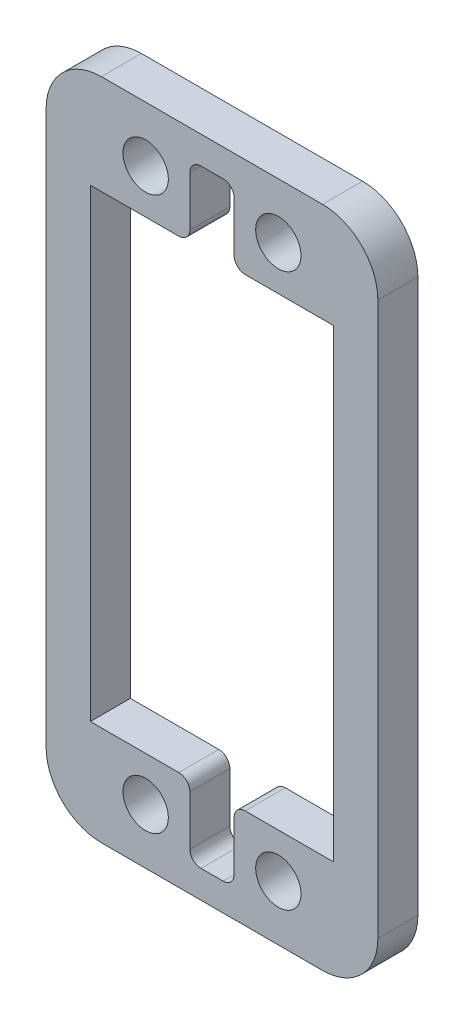
ISO-10303-21;
HEADER;
FILE_DESCRIPTION(('STEP AP214'),'2;1');
FILE_NAME('part.step','',(''),(''),'','','');
FILE_SCHEMA(('AUTOMOTIVE_DESIGN { 1 0 10303 214 1 1 1 1 }'));
ENDSEC;
DATA;
#1=APPLICATION_CONTEXT('core data for automotive mechanical design processes');
#2=APPLICATION_PROTOCOL_DEFINITION('international standard','automotive_design',2000,#1);
#3=PRODUCT_CONTEXT('',#1,'mechanical');
#4=PRODUCT('Part','Part','',(#3));
#5=PRODUCT_RELATED_PRODUCT_CATEGORY('part','',(#4));
#6=PRODUCT_DEFINITION_FORMATION('','',#4);
#7=PRODUCT_DEFINITION_CONTEXT('part definition',#1,'design');
#8=PRODUCT_DEFINITION('design','',#6,#7);
#9=PRODUCT_DEFINITION_SHAPE('','',#8);
#10=(LENGTH_UNIT() NAMED_UNIT(*) SI_UNIT(.MILLI.,.METRE.));
#11=(NAMED_UNIT(*) PLANE_ANGLE_UNIT() SI_UNIT($,.RADIAN.));
#12=(NAMED_UNIT(*) SI_UNIT($,.STERADIAN.) SOLID_ANGLE_UNIT());
#13=UNCERTAINTY_MEASURE_WITH_UNIT(LENGTH_MEASURE(1.E-05),#10,'distance_accuracy_value','');
#14=(GEOMETRIC_REPRESENTATION_CONTEXT(3) GLOBAL_UNCERTAINTY_ASSIGNED_CONTEXT((#13)) GLOBAL_UNIT_ASSIGNED_CONTEXT((#10,
#11,#12)) REPRESENTATION_CONTEXT('',''));
#15=CARTESIAN_POINT('',(0.,0.,0.));
#16=DIRECTION('',(0.,0.,1.));
#17=DIRECTION('',(1.,0.,0.));
#18=AXIS2_PLACEMENT_3D('',#15,#16,#17);
#19=CARTESIAN_POINT('',(11.,21.,3.62));
#20=DIRECTION('',(0.,1.,0.));
#21=DIRECTION('',(0.,0.,1.));
#22=AXIS2_PLACEMENT_3D('',#19,#20,#21);
#23=PLANE('',#22);
#24=DIRECTION('',(1.,0.,0.));
#25=VECTOR('',#24,1.);
#26=CARTESIAN_POINT('',(11.,21.,0.));
#27=LINE('',#26,#25);
#28=CARTESIAN_POINT('',(-11.,21.,0.));
#29=VERTEX_POINT('',#28);
#30=CARTESIAN_POINT('',(-3.,21.,0.));
#31=VERTEX_POINT('',#30);
#32=EDGE_CURVE('E252',#29,#31,#27,.T.);
#33=ORIENTED_EDGE('',*,*,#32,.T.);
#34=DIRECTION('',(0.,0.,1.));
#35=VECTOR('',#34,1.);
#36=CARTESIAN_POINT('',(-3.,21.,3.62));
#37=LINE('',#36,#35);
#38=CARTESIAN_POINT('',(-3.,21.,3.62));
#39=VERTEX_POINT('',#38);
#40=EDGE_CURVE('E388',#31,#39,#37,.T.);
#41=ORIENTED_EDGE('',*,*,#40,.T.);
#42=DIRECTION('',(1.,0.,0.));
#43=VECTOR('',#42,1.);
#44=CARTESIAN_POINT('',(11.,21.,3.62));
#45=LINE('',#44,#43);
#46=CARTESIAN_POINT('',(-11.,21.,3.62));
#47=VERTEX_POINT('',#46);
#48=EDGE_CURVE('E236',#47,#39,#45,.T.);
#49=ORIENTED_EDGE('',*,*,#48,.F.);
#50=DIRECTION('',(0.,0.,-1.));
#51=VECTOR('',#50,1.);
#52=CARTESIAN_POINT('',(-11.,21.,3.62));
#53=LINE('',#52,#51);
#54=EDGE_CURVE('E276',#47,#29,#53,.T.);
#55=ORIENTED_EDGE('',*,*,#54,.T.);
#56=EDGE_LOOP('',(#33,#41,#49,#55));
#57=FACE_BOUND('',#56,.T.);
#58=ADVANCED_FACE('F39',(#57),#23,.F.);
#59=CARTESIAN_POINT('',(-11.,-21.,3.62));
#60=DIRECTION('',(0.,-1.,0.));
#61=DIRECTION('',(0.,0.,-1.));
#62=AXIS2_PLACEMENT_3D('',#59,#60,#61);
#63=PLANE('',#62);
#64=DIRECTION('',(-1.,0.,0.));
#65=VECTOR('',#64,1.);
#66=CARTESIAN_POINT('',(-11.,-21.,3.62));
#67=LINE('',#66,#65);
#68=CARTESIAN_POINT('',(-3.00000000000001,-21.,3.62));
#69=VERTEX_POINT('',#68);
#70=CARTESIAN_POINT('',(-11.,-21.,3.62));
#71=VERTEX_POINT('',#70);
#72=EDGE_CURVE('E244',#69,#71,#67,.T.);
#73=ORIENTED_EDGE('',*,*,#72,.F.);
#74=DIRECTION('',(0.,0.,-1.));
#75=VECTOR('',#74,1.);
#76=CARTESIAN_POINT('',(-3.00000000000001,-21.,3.62));
#77=LINE('',#76,#75);
#78=CARTESIAN_POINT('',(-3.00000000000001,-21.,0.));
#79=VERTEX_POINT('',#78);
#80=EDGE_CURVE('E349',#69,#79,#77,.T.);
#81=ORIENTED_EDGE('',*,*,#80,.T.);
#82=DIRECTION('',(-1.,0.,0.));
#83=VECTOR('',#82,1.);
#84=CARTESIAN_POINT('',(-11.,-21.,0.));
#85=LINE('',#84,#83);
#86=CARTESIAN_POINT('',(-11.,-21.,0.));
#87=VERTEX_POINT('',#86);
#88=EDGE_CURVE('E266',#79,#87,#85,.T.);
#89=ORIENTED_EDGE('',*,*,#88,.T.);
#90=DIRECTION('',(0.,0.,-1.));
#91=VECTOR('',#90,1.);
#92=CARTESIAN_POINT('',(-11.,-21.,3.62));
#93=LINE('',#92,#91);
#94=EDGE_CURVE('E235',#71,#87,#93,.T.);
#95=ORIENTED_EDGE('',*,*,#94,.F.);
#96=EDGE_LOOP('',(#73,#81,#89,#95));
#97=FACE_BOUND('',#96,.T.);
#98=ADVANCED_FACE('F515',(#97),#63,.F.);
#99=CARTESIAN_POINT('',(-15.,-30.,3.62));
#100=DIRECTION('',(1.,0.,0.));
#101=DIRECTION('',(0.,0.,-1.));
#102=AXIS2_PLACEMENT_3D('',#99,#100,#101);
#103=PLANE('',#102);
#104=DIRECTION('',(0.,-1.,0.));
#105=VECTOR('',#104,1.);
#106=CARTESIAN_POINT('',(-15.,-30.,0.));
#107=LINE('',#106,#105);
#108=CARTESIAN_POINT('',(-15.,25.,0.));
#109=VERTEX_POINT('',#108);
#110=CARTESIAN_POINT('',(-15.,-25.,0.));
#111=VERTEX_POINT('',#110);
#112=EDGE_CURVE('E275',#109,#111,#107,.T.);
#113=ORIENTED_EDGE('',*,*,#112,.T.);
#114=DIRECTION('',(0.,0.,-1.));
#115=VECTOR('',#114,1.);
#116=CARTESIAN_POINT('',(-15.,-25.,3.62));
#117=LINE('',#116,#115);
#118=CARTESIAN_POINT('',(-15.,-25.,3.62));
#119=VERTEX_POINT('',#118);
#120=EDGE_CURVE('E319',#111,#119,#117,.F.);
#121=ORIENTED_EDGE('',*,*,#120,.T.);
#122=DIRECTION('',(0.,-1.,0.));
#123=VECTOR('',#122,1.);
#124=CARTESIAN_POINT('',(-15.,-30.,3.62));
#125=LINE('',#124,#123);
#126=CARTESIAN_POINT('',(-15.,25.,3.62));
#127=VERTEX_POINT('',#126);
#128=EDGE_CURVE('E280',#127,#119,#125,.T.);
#129=ORIENTED_EDGE('',*,*,#128,.F.);
#130=DIRECTION('',(0.,0.,-1.));
#131=VECTOR('',#130,1.);
#132=CARTESIAN_POINT('',(-15.,25.,3.62));
#133=LINE('',#132,#131);
#134=EDGE_CURVE('E316',#127,#109,#133,.T.);
#135=ORIENTED_EDGE('',*,*,#134,.T.);
#136=EDGE_LOOP('',(#113,#121,#129,#135));
#137=FACE_BOUND('',#136,.T.);
#138=ADVANCED_FACE('F497',(#137),#103,.F.);
#139=CARTESIAN_POINT('',(15.,-30.,3.62));
#140=DIRECTION('',(0.,1.,0.));
#141=DIRECTION('',(0.,0.,1.));
#142=AXIS2_PLACEMENT_3D('',#139,#140,#141);
#143=PLANE('',#142);
#144=DIRECTION('',(1.,0.,0.));
#145=VECTOR('',#144,1.);
#146=CARTESIAN_POINT('',(15.,-30.,3.62));
#147=LINE('',#146,#145);
#148=CARTESIAN_POINT('',(-10.,-30.,3.62));
#149=VERTEX_POINT('',#148);
#150=CARTESIAN_POINT('',(10.,-30.,3.62));
#151=VERTEX_POINT('',#150);
#152=EDGE_CURVE('E283',#149,#151,#147,.T.);
#153=ORIENTED_EDGE('',*,*,#152,.F.);
#154=DIRECTION('',(0.,0.,-1.));
#155=VECTOR('',#154,1.);
#156=CARTESIAN_POINT('',(-10.,-30.,3.62));
#157=LINE('',#156,#155);
#158=CARTESIAN_POINT('',(-10.,-30.,0.));
#159=VERTEX_POINT('',#158);
#160=EDGE_CURVE('E305',#149,#159,#157,.T.);
#161=ORIENTED_EDGE('',*,*,#160,.T.);
#162=DIRECTION('',(1.,0.,0.));
#163=VECTOR('',#162,1.);
#164=CARTESIAN_POINT('',(15.,-30.,0.));
#165=LINE('',#164,#163);
#166=CARTESIAN_POINT('',(10.,-30.,0.));
#167=VERTEX_POINT('',#166);
#168=EDGE_CURVE('E296',#159,#167,#165,.T.);
#169=ORIENTED_EDGE('',*,*,#168,.T.);
#170=DIRECTION('',(0.,0.,-1.));
#171=VECTOR('',#170,1.);
#172=CARTESIAN_POINT('',(10.,-30.,3.62));
#173=LINE('',#172,#171);
#174=EDGE_CURVE('E293',#167,#151,#173,.F.);
#175=ORIENTED_EDGE('',*,*,#174,.T.);
#176=EDGE_LOOP('',(#153,#161,#169,#175));
#177=FACE_BOUND('',#176,.T.);
#178=ADVANCED_FACE('F470',(#177),#143,.F.);
#179=CARTESIAN_POINT('',(15.,30.,3.62));
#180=DIRECTION('',(-1.,0.,0.));
#181=DIRECTION('',(0.,-1.,0.));
#182=AXIS2_PLACEMENT_3D('',#179,#180,#181);
#183=PLANE('',#182);
#184=DIRECTION('',(0.,1.,0.));
#185=VECTOR('',#184,1.);
#186=CARTESIAN_POINT('',(15.,30.,3.62));
#187=LINE('',#186,#185);
#188=CARTESIAN_POINT('',(15.,-25.,3.62));
#189=VERTEX_POINT('',#188);
#190=CARTESIAN_POINT('',(15.,25.,3.62));
#191=VERTEX_POINT('',#190);
#192=EDGE_CURVE('E287',#189,#191,#187,.T.);
#193=ORIENTED_EDGE('',*,*,#192,.F.);
#194=DIRECTION('',(0.,0.,-1.));
#195=VECTOR('',#194,1.);
#196=CARTESIAN_POINT('',(15.,-25.,3.62));
#197=LINE('',#196,#195);
#198=CARTESIAN_POINT('',(15.,-25.,0.));
#199=VERTEX_POINT('',#198);
#200=EDGE_CURVE('E331',#189,#199,#197,.T.);
#201=ORIENTED_EDGE('',*,*,#200,.T.);
#202=DIRECTION('',(0.,1.,0.));
#203=VECTOR('',#202,1.);
#204=CARTESIAN_POINT('',(15.,30.,0.));
#205=LINE('',#204,#203);
#206=CARTESIAN_POINT('',(15.,25.,0.));
#207=VERTEX_POINT('',#206);
#208=EDGE_CURVE('E299',#199,#207,#205,.T.);
#209=ORIENTED_EDGE('',*,*,#208,.T.);
#210=DIRECTION('',(0.,0.,-1.));
#211=VECTOR('',#210,1.);
#212=CARTESIAN_POINT('',(15.,25.,3.62));
#213=LINE('',#212,#211);
#214=EDGE_CURVE('E329',#207,#191,#213,.F.);
#215=ORIENTED_EDGE('',*,*,#214,.T.);
#216=EDGE_LOOP('',(#193,#201,#209,#215));
#217=FACE_BOUND('',#216,.T.);
#218=ADVANCED_FACE('F480',(#217),#183,.F.);
#219=CARTESIAN_POINT('',(-15.,30.,3.62));
#220=DIRECTION('',(0.,-1.,0.));
#221=DIRECTION('',(0.,0.,-1.));
#222=AXIS2_PLACEMENT_3D('',#219,#220,#221);
#223=PLANE('',#222);
#224=DIRECTION('',(-1.,0.,0.));
#225=VECTOR('',#224,1.);
#226=CARTESIAN_POINT('',(-15.,30.,3.62));
#227=LINE('',#226,#225);
#228=CARTESIAN_POINT('',(9.99999999999999,30.,3.62));
#229=VERTEX_POINT('',#228);
#230=CARTESIAN_POINT('',(-10.,30.,3.62));
#231=VERTEX_POINT('',#230);
#232=EDGE_CURVE('E290',#229,#231,#227,.T.);
#233=ORIENTED_EDGE('',*,*,#232,.F.);
#234=DIRECTION('',(0.,0.,-1.));
#235=VECTOR('',#234,1.);
#236=CARTESIAN_POINT('',(10.,30.,3.62));
#237=LINE('',#236,#235);
#238=CARTESIAN_POINT('',(9.99999999999999,30.,0.));
#239=VERTEX_POINT('',#238);
#240=EDGE_CURVE('E336',#229,#239,#237,.T.);
#241=ORIENTED_EDGE('',*,*,#240,.T.);
#242=DIRECTION('',(-1.,0.,0.));
#243=VECTOR('',#242,1.);
#244=CARTESIAN_POINT('',(-15.,30.,0.));
#245=LINE('',#244,#243);
#246=CARTESIAN_POINT('',(-10.,30.,0.));
#247=VERTEX_POINT('',#246);
#248=EDGE_CURVE('E284',#239,#247,#245,.T.);
#249=ORIENTED_EDGE('',*,*,#248,.T.);
#250=DIRECTION('',(0.,0.,-1.));
#251=VECTOR('',#250,1.);
#252=CARTESIAN_POINT('',(-10.,30.,3.62));
#253=LINE('',#252,#251);
#254=EDGE_CURVE('E334',#247,#231,#253,.F.);
#255=ORIENTED_EDGE('',*,*,#254,.T.);
#256=EDGE_LOOP('',(#233,#241,#249,#255));
#257=FACE_BOUND('',#256,.T.);
#258=ADVANCED_FACE('F488',(#257),#223,.F.);
#259=CARTESIAN_POINT('',(0.,0.,3.62));
#260=DIRECTION('',(0.,0.,-1.));
#261=DIRECTION('',(-1.,0.,0.));
#262=AXIS2_PLACEMENT_3D('',#259,#260,#261);
#263=PLANE('',#262);
#264=CARTESIAN_POINT('',(-6.,25.,3.62));
#265=DIRECTION('',(0.,0.,-1.));
#266=DIRECTION('',(-1.,0.,0.));
#267=AXIS2_PLACEMENT_3D('',#264,#265,#266);
#268=CIRCLE('',#267,2.05);
#269=CARTESIAN_POINT('',(-8.05,25.,3.62));
#270=VERTEX_POINT('',#269);
#271=EDGE_CURVE('E445',#270,#270,#268,.T.);
#272=ORIENTED_EDGE('',*,*,#271,.T.);
#273=EDGE_LOOP('',(#272));
#274=FACE_BOUND('',#273,.T.);
#275=CARTESIAN_POINT('',(6.,-25.,3.62));
#276=DIRECTION('',(0.,0.,-1.));
#277=DIRECTION('',(-1.,0.,0.));
#278=AXIS2_PLACEMENT_3D('',#275,#276,#277);
#279=CIRCLE('',#278,2.05);
#280=CARTESIAN_POINT('',(3.95,-25.,3.62));
#281=VERTEX_POINT('',#280);
#282=EDGE_CURVE('E451',#281,#281,#279,.T.);
#283=ORIENTED_EDGE('',*,*,#282,.T.);
#284=EDGE_LOOP('',(#283));
#285=FACE_BOUND('',#284,.T.);
#286=CARTESIAN_POINT('',(-6.,-25.,3.62));
#287=DIRECTION('',(0.,0.,-1.));
#288=DIRECTION('',(-1.,0.,0.));
#289=AXIS2_PLACEMENT_3D('',#286,#287,#288);
#290=CIRCLE('',#289,2.05);
#291=CARTESIAN_POINT('',(-8.05,-25.,3.62));
#292=VERTEX_POINT('',#291);
#293=EDGE_CURVE('E849',#292,#292,#290,.T.);
#294=ORIENTED_EDGE('',*,*,#293,.T.);
#295=EDGE_LOOP('',(#294));
#296=FACE_BOUND('',#295,.T.);
#297=DIRECTION('',(0.,1.,0.));
#298=VECTOR('',#297,1.);
#299=CARTESIAN_POINT('',(-2.,27.5,3.62));
#300=LINE('',#299,#298);
#301=CARTESIAN_POINT('',(-2.00000000000001,-26.5,3.62));
#302=VERTEX_POINT('',#301);
#303=CARTESIAN_POINT('',(-2.00000000000001,-22.,3.62));
#304=VERTEX_POINT('',#303);
#305=EDGE_CURVE('E435',#302,#304,#300,.T.);
#306=ORIENTED_EDGE('',*,*,#305,.T.);
#307=CARTESIAN_POINT('',(-3.00000000000001,-22.,3.62));
#308=DIRECTION('',(0.,0.,-1.));
#309=DIRECTION('',(-1.,0.,0.));
#310=AXIS2_PLACEMENT_3D('',#307,#308,#309);
#311=CIRCLE('',#310,1.);
#312=EDGE_CURVE('E365',#304,#69,#311,.F.);
#313=ORIENTED_EDGE('',*,*,#312,.T.);
#314=ORIENTED_EDGE('',*,*,#72,.T.);
#315=DIRECTION('',(0.,1.,0.));
#316=VECTOR('',#315,1.);
#317=CARTESIAN_POINT('',(-11.,21.,3.62));
#318=LINE('',#317,#316);
#319=EDGE_CURVE('E243',#71,#47,#318,.T.);
#320=ORIENTED_EDGE('',*,*,#319,.T.);
#321=ORIENTED_EDGE('',*,*,#48,.T.);
#322=CARTESIAN_POINT('',(-3.,22.,3.62));
#323=DIRECTION('',(0.,0.,-1.));
#324=DIRECTION('',(-1.,0.,0.));
#325=AXIS2_PLACEMENT_3D('',#322,#323,#324);
#326=CIRCLE('',#325,1.);
#327=CARTESIAN_POINT('',(-2.,22.,3.62));
#328=VERTEX_POINT('',#327);
#329=EDGE_CURVE('E360',#39,#328,#326,.F.);
#330=ORIENTED_EDGE('',*,*,#329,.T.);
#331=CARTESIAN_POINT('',(-2.,26.5,3.62));
#332=VERTEX_POINT('',#331);
#333=EDGE_CURVE('E429',#328,#332,#300,.T.);
#334=ORIENTED_EDGE('',*,*,#333,.T.);
#335=CARTESIAN_POINT('',(-1.,26.5,3.62));
#336=DIRECTION('',(0.,0.,-1.));
#337=DIRECTION('',(-1.,0.,0.));
#338=AXIS2_PLACEMENT_3D('',#335,#336,#337);
#339=CIRCLE('',#338,1.);
#340=CARTESIAN_POINT('',(-1.,27.5,3.62));
#341=VERTEX_POINT('',#340);
#342=EDGE_CURVE('E11',#332,#341,#339,.T.);
#343=ORIENTED_EDGE('',*,*,#342,.T.);
#344=DIRECTION('',(1.,0.,0.));
#345=VECTOR('',#344,1.);
#346=CARTESIAN_POINT('',(2.,27.5,3.62));
#347=LINE('',#346,#345);
#348=CARTESIAN_POINT('',(1.,27.5,3.62));
#349=VERTEX_POINT('',#348);
#350=EDGE_CURVE('E427',#341,#349,#347,.T.);
#351=ORIENTED_EDGE('',*,*,#350,.T.);
#352=CARTESIAN_POINT('',(1.,26.5,3.62));
#353=DIRECTION('',(0.,0.,-1.));
#354=DIRECTION('',(-1.,0.,0.));
#355=AXIS2_PLACEMENT_3D('',#352,#353,#354);
#356=CIRCLE('',#355,1.);
#357=CARTESIAN_POINT('',(2.,26.5,3.62));
#358=VERTEX_POINT('',#357);
#359=EDGE_CURVE('E401',#349,#358,#356,.T.);
#360=ORIENTED_EDGE('',*,*,#359,.T.);
#361=DIRECTION('',(0.,-1.,0.));
#362=VECTOR('',#361,1.);
#363=CARTESIAN_POINT('',(2.,21.,3.62));
#364=LINE('',#363,#362);
#365=CARTESIAN_POINT('',(2.,22.,3.62));
#366=VERTEX_POINT('',#365);
#367=EDGE_CURVE('E433',#358,#366,#364,.T.);
#368=ORIENTED_EDGE('',*,*,#367,.T.);
#369=CARTESIAN_POINT('',(3.,22.,3.62));
#370=DIRECTION('',(0.,0.,-1.));
#371=DIRECTION('',(-1.,0.,0.));
#372=AXIS2_PLACEMENT_3D('',#369,#370,#371);
#373=CIRCLE('',#372,1.);
#374=CARTESIAN_POINT('',(3.,21.,3.62));
#375=VERTEX_POINT('',#374);
#376=EDGE_CURVE('E362',#366,#375,#373,.F.);
#377=ORIENTED_EDGE('',*,*,#376,.T.);
#378=CARTESIAN_POINT('',(11.,21.,3.62));
#379=VERTEX_POINT('',#378);
#380=EDGE_CURVE('E250',#375,#379,#45,.T.);
#381=ORIENTED_EDGE('',*,*,#380,.T.);
#382=DIRECTION('',(0.,-1.,0.));
#383=VECTOR('',#382,1.);
#384=CARTESIAN_POINT('',(11.,-21.,3.62));
#385=LINE('',#384,#383);
#386=CARTESIAN_POINT('',(11.,-21.,3.62));
#387=VERTEX_POINT('',#386);
#388=EDGE_CURVE('E229',#379,#387,#385,.T.);
#389=ORIENTED_EDGE('',*,*,#388,.T.);
#390=CARTESIAN_POINT('',(2.99999999999999,-21.,3.62));
#391=VERTEX_POINT('',#390);
#392=EDGE_CURVE('E239',#387,#391,#67,.T.);
#393=ORIENTED_EDGE('',*,*,#392,.T.);
#394=CARTESIAN_POINT('',(2.99999999999999,-22.,3.62));
#395=DIRECTION('',(0.,0.,-1.));
#396=DIRECTION('',(-1.,0.,0.));
#397=AXIS2_PLACEMENT_3D('',#394,#395,#396);
#398=CIRCLE('',#397,1.);
#399=CARTESIAN_POINT('',(2.,-22.,3.62));
#400=VERTEX_POINT('',#399);
#401=EDGE_CURVE('E61',#391,#400,#398,.F.);
#402=ORIENTED_EDGE('',*,*,#401,.T.);
#403=CARTESIAN_POINT('',(2.,-26.5,3.62));
#404=VERTEX_POINT('',#403);
#405=EDGE_CURVE('E438',#400,#404,#364,.T.);
#406=ORIENTED_EDGE('',*,*,#405,.T.);
#407=CARTESIAN_POINT('',(0.999999999999993,-26.5,3.62));
#408=DIRECTION('',(0.,0.,-1.));
#409=DIRECTION('',(-1.,0.,0.));
#410=AXIS2_PLACEMENT_3D('',#407,#408,#409);
#411=CIRCLE('',#410,1.);
#412=CARTESIAN_POINT('',(0.999999999999993,-27.5,3.62));
#413=VERTEX_POINT('',#412);
#414=EDGE_CURVE('E397',#404,#413,#411,.T.);
#415=ORIENTED_EDGE('',*,*,#414,.T.);
#416=DIRECTION('',(-1.,0.,0.));
#417=VECTOR('',#416,1.);
#418=CARTESIAN_POINT('',(-2.00000000000001,-27.5,3.62));
#419=LINE('',#418,#417);
#420=CARTESIAN_POINT('',(-1.00000000000001,-27.5,3.62));
#421=VERTEX_POINT('',#420);
#422=EDGE_CURVE('E556',#413,#421,#419,.T.);
#423=ORIENTED_EDGE('',*,*,#422,.T.);
#424=CARTESIAN_POINT('',(-1.00000000000001,-26.5,3.62));
#425=DIRECTION('',(0.,0.,-1.));
#426=DIRECTION('',(-1.,0.,0.));
#427=AXIS2_PLACEMENT_3D('',#424,#425,#426);
#428=CIRCLE('',#427,1.);
#429=EDGE_CURVE('E393',#421,#302,#428,.T.);
#430=ORIENTED_EDGE('',*,*,#429,.T.);
#431=EDGE_LOOP('',(#306,#313,#314,#320,#321,#330,#334,#343,#351,#360,#368,#377,#381,#389,#393,
#402,#406,#415,#423,#430));
#432=FACE_BOUND('',#431,.T.);
#433=CARTESIAN_POINT('',(6.,25.,3.62));
#434=DIRECTION('',(0.,0.,-1.));
#435=DIRECTION('',(-1.,0.,0.));
#436=AXIS2_PLACEMENT_3D('',#433,#434,#435);
#437=CIRCLE('',#436,2.05);
#438=CARTESIAN_POINT('',(3.95,25.,3.62));
#439=VERTEX_POINT('',#438);
#440=EDGE_CURVE('E267',#439,#439,#437,.T.);
#441=ORIENTED_EDGE('',*,*,#440,.T.);
#442=EDGE_LOOP('',(#441));
#443=FACE_BOUND('',#442,.T.);
#444=ORIENTED_EDGE('',*,*,#128,.T.);
#445=CARTESIAN_POINT('',(-10.,-25.,3.62));
#446=DIRECTION('',(0.,0.,-1.));
#447=DIRECTION('',(-1.,0.,0.));
#448=AXIS2_PLACEMENT_3D('',#445,#446,#447);
#449=CIRCLE('',#448,5.);
#450=EDGE_CURVE('E327',#119,#149,#449,.F.);
#451=ORIENTED_EDGE('',*,*,#450,.T.);
#452=ORIENTED_EDGE('',*,*,#152,.T.);
#453=CARTESIAN_POINT('',(10.,-25.,3.62));
#454=DIRECTION('',(0.,0.,-1.));
#455=DIRECTION('',(-1.,0.,0.));
#456=AXIS2_PLACEMENT_3D('',#453,#454,#455);
#457=CIRCLE('',#456,5.);
#458=EDGE_CURVE('E325',#151,#189,#457,.F.);
#459=ORIENTED_EDGE('',*,*,#458,.T.);
#460=ORIENTED_EDGE('',*,*,#192,.T.);
#461=CARTESIAN_POINT('',(10.,25.,3.62));
#462=DIRECTION('',(0.,0.,-1.));
#463=DIRECTION('',(-1.,0.,0.));
#464=AXIS2_PLACEMENT_3D('',#461,#462,#463);
#465=CIRCLE('',#464,5.);
#466=EDGE_CURVE('E323',#191,#229,#465,.F.);
#467=ORIENTED_EDGE('',*,*,#466,.T.);
#468=ORIENTED_EDGE('',*,*,#232,.T.);
#469=CARTESIAN_POINT('',(-10.,25.,3.62));
#470=DIRECTION('',(0.,0.,-1.));
#471=DIRECTION('',(-1.,0.,0.));
#472=AXIS2_PLACEMENT_3D('',#469,#470,#471);
#473=CIRCLE('',#472,5.);
#474=EDGE_CURVE('E321',#231,#127,#473,.F.);
#475=ORIENTED_EDGE('',*,*,#474,.T.);
#476=EDGE_LOOP('',(#444,#451,#452,#459,#460,#467,#468,#475));
#477=FACE_BOUND('',#476,.T.);
#478=ADVANCED_FACE('F247',(#274,#285,#296,#432,#443,#477),#263,.F.);
#479=CARTESIAN_POINT('',(0.,0.,0.));
#480=DIRECTION('',(0.,0.,-1.));
#481=DIRECTION('',(-1.,0.,0.));
#482=AXIS2_PLACEMENT_3D('',#479,#480,#481);
#483=PLANE('',#482);
#484=CARTESIAN_POINT('',(-6.,25.,0.));
#485=DIRECTION('',(0.,0.,-1.));
#486=DIRECTION('',(-1.,0.,0.));
#487=AXIS2_PLACEMENT_3D('',#484,#485,#486);
#488=CIRCLE('',#487,2.05);
#489=CARTESIAN_POINT('',(-8.05,25.,0.));
#490=VERTEX_POINT('',#489);
#491=EDGE_CURVE('E442',#490,#490,#488,.T.);
#492=ORIENTED_EDGE('',*,*,#491,.F.);
#493=EDGE_LOOP('',(#492));
#494=FACE_BOUND('',#493,.T.);
#495=CARTESIAN_POINT('',(6.,-25.,0.));
#496=DIRECTION('',(0.,0.,-1.));
#497=DIRECTION('',(-1.,0.,0.));
#498=AXIS2_PLACEMENT_3D('',#495,#496,#497);
#499=CIRCLE('',#498,2.05);
#500=CARTESIAN_POINT('',(3.95,-25.,0.));
#501=VERTEX_POINT('',#500);
#502=EDGE_CURVE('E448',#501,#501,#499,.T.);
#503=ORIENTED_EDGE('',*,*,#502,.F.);
#504=EDGE_LOOP('',(#503));
#505=FACE_BOUND('',#504,.T.);
#506=CARTESIAN_POINT('',(-6.,-25.,0.));
#507=DIRECTION('',(0.,0.,-1.));
#508=DIRECTION('',(-1.,0.,0.));
#509=AXIS2_PLACEMENT_3D('',#506,#507,#508);
#510=CIRCLE('',#509,2.05);
#511=CARTESIAN_POINT('',(-8.05,-25.,0.));
#512=VERTEX_POINT('',#511);
#513=EDGE_CURVE('E453',#512,#512,#510,.T.);
#514=ORIENTED_EDGE('',*,*,#513,.F.);
#515=EDGE_LOOP('',(#514));
#516=FACE_BOUND('',#515,.T.);
#517=ORIENTED_EDGE('',*,*,#88,.F.);
#518=CARTESIAN_POINT('',(-3.00000000000001,-22.,0.));
#519=DIRECTION('',(0.,0.,-1.));
#520=DIRECTION('',(-1.,0.,0.));
#521=AXIS2_PLACEMENT_3D('',#518,#519,#520);
#522=CIRCLE('',#521,1.);
#523=CARTESIAN_POINT('',(-2.00000000000001,-22.,0.));
#524=VERTEX_POINT('',#523);
#525=EDGE_CURVE('E358',#79,#524,#522,.T.);
#526=ORIENTED_EDGE('',*,*,#525,.T.);
#527=DIRECTION('',(0.,1.,0.));
#528=VECTOR('',#527,1.);
#529=CARTESIAN_POINT('',(-2.,27.5,0.));
#530=LINE('',#529,#528);
#531=CARTESIAN_POINT('',(-2.00000000000001,-26.5,0.));
#532=VERTEX_POINT('',#531);
#533=EDGE_CURVE('E421',#532,#524,#530,.T.);
#534=ORIENTED_EDGE('',*,*,#533,.F.);
#535=CARTESIAN_POINT('',(-1.00000000000001,-26.5,0.));
#536=DIRECTION('',(0.,0.,-1.));
#537=DIRECTION('',(-1.,0.,0.));
#538=AXIS2_PLACEMENT_3D('',#535,#536,#537);
#539=CIRCLE('',#538,1.);
#540=CARTESIAN_POINT('',(-1.00000000000001,-27.5,0.));
#541=VERTEX_POINT('',#540);
#542=EDGE_CURVE('E391',#532,#541,#539,.F.);
#543=ORIENTED_EDGE('',*,*,#542,.T.);
#544=DIRECTION('',(-1.,0.,0.));
#545=VECTOR('',#544,1.);
#546=CARTESIAN_POINT('',(-2.00000000000001,-27.5,0.));
#547=LINE('',#546,#545);
#548=CARTESIAN_POINT('',(0.999999999999993,-27.5,0.));
#549=VERTEX_POINT('',#548);
#550=EDGE_CURVE('E553',#549,#541,#547,.T.);
#551=ORIENTED_EDGE('',*,*,#550,.F.);
#552=CARTESIAN_POINT('',(0.999999999999993,-26.5,0.));
#553=DIRECTION('',(0.,0.,-1.));
#554=DIRECTION('',(-1.,0.,0.));
#555=AXIS2_PLACEMENT_3D('',#552,#553,#554);
#556=CIRCLE('',#555,1.);
#557=CARTESIAN_POINT('',(1.99999999999999,-26.5,0.));
#558=VERTEX_POINT('',#557);
#559=EDGE_CURVE('E395',#549,#558,#556,.F.);
#560=ORIENTED_EDGE('',*,*,#559,.T.);
#561=DIRECTION('',(0.,-1.,0.));
#562=VECTOR('',#561,1.);
#563=CARTESIAN_POINT('',(1.99999999999999,-27.5,0.));
#564=LINE('',#563,#562);
#565=CARTESIAN_POINT('',(1.99999999999999,-22.,0.));
#566=VERTEX_POINT('',#565);
#567=EDGE_CURVE('E550',#566,#558,#564,.T.);
#568=ORIENTED_EDGE('',*,*,#567,.F.);
#569=CARTESIAN_POINT('',(2.99999999999999,-22.,0.));
#570=DIRECTION('',(0.,0.,-1.));
#571=DIRECTION('',(-1.,0.,0.));
#572=AXIS2_PLACEMENT_3D('',#569,#570,#571);
#573=CIRCLE('',#572,1.);
#574=CARTESIAN_POINT('',(2.99999999999999,-21.,0.));
#575=VERTEX_POINT('',#574);
#576=EDGE_CURVE('E356',#566,#575,#573,.T.);
#577=ORIENTED_EDGE('',*,*,#576,.T.);
#578=CARTESIAN_POINT('',(11.,-21.,0.));
#579=VERTEX_POINT('',#578);
#580=EDGE_CURVE('E268',#579,#575,#85,.T.);
#581=ORIENTED_EDGE('',*,*,#580,.F.);
#582=DIRECTION('',(0.,-1.,0.));
#583=VECTOR('',#582,1.);
#584=CARTESIAN_POINT('',(11.,-21.,0.));
#585=LINE('',#584,#583);
#586=CARTESIAN_POINT('',(11.,21.,0.));
#587=VERTEX_POINT('',#586);
#588=EDGE_CURVE('E231',#587,#579,#585,.T.);
#589=ORIENTED_EDGE('',*,*,#588,.F.);
#590=CARTESIAN_POINT('',(3.,21.,0.));
#591=VERTEX_POINT('',#590);
#592=EDGE_CURVE('E255',#591,#587,#27,.T.);
#593=ORIENTED_EDGE('',*,*,#592,.F.);
#594=CARTESIAN_POINT('',(3.,22.,0.));
#595=DIRECTION('',(0.,0.,-1.));
#596=DIRECTION('',(-1.,0.,0.));
#597=AXIS2_PLACEMENT_3D('',#594,#595,#596);
#598=CIRCLE('',#597,1.);
#599=CARTESIAN_POINT('',(2.,22.,0.));
#600=VERTEX_POINT('',#599);
#601=EDGE_CURVE('E354',#591,#600,#598,.T.);
#602=ORIENTED_EDGE('',*,*,#601,.T.);
#603=CARTESIAN_POINT('',(2.,26.5,0.));
#604=VERTEX_POINT('',#603);
#605=EDGE_CURVE('E545',#604,#600,#564,.T.);
#606=ORIENTED_EDGE('',*,*,#605,.F.);
#607=CARTESIAN_POINT('',(1.,26.5,0.));
#608=DIRECTION('',(0.,0.,-1.));
#609=DIRECTION('',(-1.,0.,0.));
#610=AXIS2_PLACEMENT_3D('',#607,#608,#609);
#611=CIRCLE('',#610,1.);
#612=CARTESIAN_POINT('',(1.,27.5,0.));
#613=VERTEX_POINT('',#612);
#614=EDGE_CURVE('E399',#604,#613,#611,.F.);
#615=ORIENTED_EDGE('',*,*,#614,.T.);
#616=DIRECTION('',(1.,0.,0.));
#617=VECTOR('',#616,1.);
#618=CARTESIAN_POINT('',(2.,27.5,0.));
#619=LINE('',#618,#617);
#620=CARTESIAN_POINT('',(-1.,27.5,0.));
#621=VERTEX_POINT('',#620);
#622=EDGE_CURVE('E412',#621,#613,#619,.T.);
#623=ORIENTED_EDGE('',*,*,#622,.F.);
#624=CARTESIAN_POINT('',(-1.,26.5,0.));
#625=DIRECTION('',(0.,0.,-1.));
#626=DIRECTION('',(-1.,0.,0.));
#627=AXIS2_PLACEMENT_3D('',#624,#625,#626);
#628=CIRCLE('',#627,1.);
#629=CARTESIAN_POINT('',(-2.,26.5,0.));
#630=VERTEX_POINT('',#629);
#631=EDGE_CURVE('E47',#621,#630,#628,.F.);
#632=ORIENTED_EDGE('',*,*,#631,.T.);
#633=CARTESIAN_POINT('',(-2.,22.,0.));
#634=VERTEX_POINT('',#633);
#635=EDGE_CURVE('E409',#634,#630,#530,.T.);
#636=ORIENTED_EDGE('',*,*,#635,.F.);
#637=CARTESIAN_POINT('',(-3.,22.,0.));
#638=DIRECTION('',(0.,0.,-1.));
#639=DIRECTION('',(-1.,0.,0.));
#640=AXIS2_PLACEMENT_3D('',#637,#638,#639);
#641=CIRCLE('',#640,1.);
#642=EDGE_CURVE('E352',#634,#31,#641,.T.);
#643=ORIENTED_EDGE('',*,*,#642,.T.);
#644=ORIENTED_EDGE('',*,*,#32,.F.);
#645=DIRECTION('',(0.,1.,0.));
#646=VECTOR('',#645,1.);
#647=CARTESIAN_POINT('',(-11.,21.,0.));
#648=LINE('',#647,#646);
#649=EDGE_CURVE('E270',#87,#29,#648,.T.);
#650=ORIENTED_EDGE('',*,*,#649,.F.);
#651=EDGE_LOOP('',(#517,#526,#534,#543,#551,#560,#568,#577,#581,#589,#593,#602,#606,#615,#623,
#632,#636,#643,#644,#650));
#652=FACE_BOUND('',#651,.T.);
#653=CARTESIAN_POINT('',(6.,25.,0.));
#654=DIRECTION('',(0.,0.,-1.));
#655=DIRECTION('',(-1.,0.,0.));
#656=AXIS2_PLACEMENT_3D('',#653,#654,#655);
#657=CIRCLE('',#656,2.05);
#658=CARTESIAN_POINT('',(3.95,25.,0.));
#659=VERTEX_POINT('',#658);
#660=EDGE_CURVE('E258',#659,#659,#657,.T.);
#661=ORIENTED_EDGE('',*,*,#660,.F.);
#662=EDGE_LOOP('',(#661));
#663=FACE_BOUND('',#662,.T.);
#664=ORIENTED_EDGE('',*,*,#168,.F.);
#665=CARTESIAN_POINT('',(-10.,-25.,0.));
#666=DIRECTION('',(0.,0.,-1.));
#667=DIRECTION('',(-1.,0.,0.));
#668=AXIS2_PLACEMENT_3D('',#665,#666,#667);
#669=CIRCLE('',#668,5.);
#670=EDGE_CURVE('E314',#159,#111,#669,.T.);
#671=ORIENTED_EDGE('',*,*,#670,.T.);
#672=ORIENTED_EDGE('',*,*,#112,.F.);
#673=CARTESIAN_POINT('',(-10.,25.,0.));
#674=DIRECTION('',(0.,0.,-1.));
#675=DIRECTION('',(-1.,0.,0.));
#676=AXIS2_PLACEMENT_3D('',#673,#674,#675);
#677=CIRCLE('',#676,5.);
#678=EDGE_CURVE('E308',#109,#247,#677,.T.);
#679=ORIENTED_EDGE('',*,*,#678,.T.);
#680=ORIENTED_EDGE('',*,*,#248,.F.);
#681=CARTESIAN_POINT('',(10.,25.,0.));
#682=DIRECTION('',(0.,0.,-1.));
#683=DIRECTION('',(-1.,0.,0.));
#684=AXIS2_PLACEMENT_3D('',#681,#682,#683);
#685=CIRCLE('',#684,5.);
#686=EDGE_CURVE('E310',#239,#207,#685,.T.);
#687=ORIENTED_EDGE('',*,*,#686,.T.);
#688=ORIENTED_EDGE('',*,*,#208,.F.);
#689=CARTESIAN_POINT('',(10.,-25.,0.));
#690=DIRECTION('',(0.,0.,-1.));
#691=DIRECTION('',(-1.,0.,0.));
#692=AXIS2_PLACEMENT_3D('',#689,#690,#691);
#693=CIRCLE('',#692,5.);
#694=EDGE_CURVE('E312',#199,#167,#693,.T.);
#695=ORIENTED_EDGE('',*,*,#694,.T.);
#696=EDGE_LOOP('',(#664,#671,#672,#679,#680,#687,#688,#695));
#697=FACE_BOUND('',#696,.T.);
#698=ADVANCED_FACE('F407',(#494,#505,#516,#652,#663,#697),#483,.T.);
#699=CARTESIAN_POINT('',(11.,-21.,3.62));
#700=DIRECTION('',(1.,0.,0.));
#701=DIRECTION('',(0.,0.,-1.));
#702=AXIS2_PLACEMENT_3D('',#699,#700,#701);
#703=PLANE('',#702);
#704=ORIENTED_EDGE('',*,*,#588,.T.);
#705=DIRECTION('',(0.,0.,-1.));
#706=VECTOR('',#705,1.);
#707=CARTESIAN_POINT('',(11.,-21.,3.62));
#708=LINE('',#707,#706);
#709=EDGE_CURVE('E224',#387,#579,#708,.T.);
#710=ORIENTED_EDGE('',*,*,#709,.F.);
#711=ORIENTED_EDGE('',*,*,#388,.F.);
#712=DIRECTION('',(0.,0.,-1.));
#713=VECTOR('',#712,1.);
#714=CARTESIAN_POINT('',(11.,21.,3.62));
#715=LINE('',#714,#713);
#716=EDGE_CURVE('E273',#379,#587,#715,.T.);
#717=ORIENTED_EDGE('',*,*,#716,.T.);
#718=EDGE_LOOP('',(#704,#710,#711,#717));
#719=FACE_BOUND('',#718,.T.);
#720=ADVANCED_FACE('F226',(#719),#703,.F.);
#721=ORIENTED_EDGE('',*,*,#380,.F.);
#722=DIRECTION('',(0.,0.,-1.));
#723=VECTOR('',#722,1.);
#724=CARTESIAN_POINT('',(3.,21.,3.62));
#725=LINE('',#724,#723);
#726=EDGE_CURVE('E385',#375,#591,#725,.T.);
#727=ORIENTED_EDGE('',*,*,#726,.T.);
#728=ORIENTED_EDGE('',*,*,#592,.T.);
#729=ORIENTED_EDGE('',*,*,#716,.F.);
#730=EDGE_LOOP('',(#721,#727,#728,#729));
#731=FACE_BOUND('',#730,.T.);
#732=ADVANCED_FACE('F518',(#731),#23,.F.);
#733=CARTESIAN_POINT('',(-11.,21.,3.62));
#734=DIRECTION('',(-1.,0.,0.));
#735=DIRECTION('',(0.,0.,1.));
#736=AXIS2_PLACEMENT_3D('',#733,#734,#735);
#737=PLANE('',#736);
#738=ORIENTED_EDGE('',*,*,#649,.T.);
#739=ORIENTED_EDGE('',*,*,#54,.F.);
#740=ORIENTED_EDGE('',*,*,#319,.F.);
#741=ORIENTED_EDGE('',*,*,#94,.T.);
#742=EDGE_LOOP('',(#738,#739,#740,#741));
#743=FACE_BOUND('',#742,.T.);
#744=ADVANCED_FACE('F528',(#743),#737,.F.);
#745=ORIENTED_EDGE('',*,*,#580,.T.);
#746=DIRECTION('',(0.,0.,1.));
#747=VECTOR('',#746,1.);
#748=CARTESIAN_POINT('',(2.99999999999999,-21.,3.62));
#749=LINE('',#748,#747);
#750=EDGE_CURVE('E242',#575,#391,#749,.T.);
#751=ORIENTED_EDGE('',*,*,#750,.T.);
#752=ORIENTED_EDGE('',*,*,#392,.F.);
#753=ORIENTED_EDGE('',*,*,#709,.T.);
#754=EDGE_LOOP('',(#745,#751,#752,#753));
#755=FACE_BOUND('',#754,.T.);
#756=ADVANCED_FACE('F240',(#755),#63,.F.);
#757=CARTESIAN_POINT('',(-2.,27.5,3.62));
#758=DIRECTION('',(-1.,0.,0.));
#759=DIRECTION('',(0.,-1.,0.));
#760=AXIS2_PLACEMENT_3D('',#757,#758,#759);
#761=PLANE('',#760);
#762=ORIENTED_EDGE('',*,*,#305,.F.);
#763=DIRECTION('',(0.,0.,-1.));
#764=VECTOR('',#763,1.);
#765=CARTESIAN_POINT('',(-2.00000000000001,-26.5,0.));
#766=LINE('',#765,#764);
#767=EDGE_CURVE('E341',#302,#532,#766,.T.);
#768=ORIENTED_EDGE('',*,*,#767,.T.);
#769=ORIENTED_EDGE('',*,*,#533,.T.);
#770=DIRECTION('',(0.,0.,-1.));
#771=VECTOR('',#770,1.);
#772=CARTESIAN_POINT('',(-2.00000000000001,-22.,3.62));
#773=LINE('',#772,#771);
#774=EDGE_CURVE('E339',#524,#304,#773,.F.);
#775=ORIENTED_EDGE('',*,*,#774,.T.);
#776=EDGE_LOOP('',(#762,#768,#769,#775));
#777=FACE_BOUND('',#776,.T.);
#778=ADVANCED_FACE('F694',(#777),#761,.F.);
#779=CARTESIAN_POINT('',(1.99999999999999,-27.5,3.62));
#780=DIRECTION('',(1.,0.,0.));
#781=DIRECTION('',(0.,1.,0.));
#782=AXIS2_PLACEMENT_3D('',#779,#780,#781);
#783=PLANE('',#782);
#784=ORIENTED_EDGE('',*,*,#405,.F.);
#785=DIRECTION('',(0.,0.,1.));
#786=VECTOR('',#785,1.);
#787=CARTESIAN_POINT('',(1.99999999999999,-22.,3.62));
#788=LINE('',#787,#786);
#789=EDGE_CURVE('E369',#400,#566,#788,.F.);
#790=ORIENTED_EDGE('',*,*,#789,.T.);
#791=ORIENTED_EDGE('',*,*,#567,.T.);
#792=DIRECTION('',(0.,0.,-1.));
#793=VECTOR('',#792,1.);
#794=CARTESIAN_POINT('',(1.99999999999999,-26.5,3.62));
#795=LINE('',#794,#793);
#796=EDGE_CURVE('E54',#558,#404,#795,.F.);
#797=ORIENTED_EDGE('',*,*,#796,.T.);
#798=EDGE_LOOP('',(#784,#790,#791,#797));
#799=FACE_BOUND('',#798,.T.);
#800=ADVANCED_FACE('F686',(#799),#783,.F.);
#801=CARTESIAN_POINT('',(-2.00000000000001,-27.5,3.62));
#802=DIRECTION('',(0.,-1.,0.));
#803=DIRECTION('',(0.,0.,-1.));
#804=AXIS2_PLACEMENT_3D('',#801,#802,#803);
#805=PLANE('',#804);
#806=ORIENTED_EDGE('',*,*,#550,.T.);
#807=DIRECTION('',(0.,0.,-1.));
#808=VECTOR('',#807,1.);
#809=CARTESIAN_POINT('',(-1.00000000000001,-27.5,3.62));
#810=LINE('',#809,#808);
#811=EDGE_CURVE('E347',#541,#421,#810,.F.);
#812=ORIENTED_EDGE('',*,*,#811,.T.);
#813=ORIENTED_EDGE('',*,*,#422,.F.);
#814=DIRECTION('',(0.,0.,-1.));
#815=VECTOR('',#814,1.);
#816=CARTESIAN_POINT('',(0.999999999999993,-27.5,0.));
#817=LINE('',#816,#815);
#818=EDGE_CURVE('E344',#413,#549,#817,.T.);
#819=ORIENTED_EDGE('',*,*,#818,.T.);
#820=EDGE_LOOP('',(#806,#812,#813,#819));
#821=FACE_BOUND('',#820,.T.);
#822=ADVANCED_FACE('F568',(#821),#805,.F.);
#823=ORIENTED_EDGE('',*,*,#635,.T.);
#824=DIRECTION('',(0.,0.,-1.));
#825=VECTOR('',#824,1.);
#826=CARTESIAN_POINT('',(-2.,26.5,3.62));
#827=LINE('',#826,#825);
#828=EDGE_CURVE('E383',#630,#332,#827,.F.);
#829=ORIENTED_EDGE('',*,*,#828,.T.);
#830=ORIENTED_EDGE('',*,*,#333,.F.);
#831=DIRECTION('',(0.,0.,1.));
#832=VECTOR('',#831,1.);
#833=CARTESIAN_POINT('',(-2.,22.,3.62));
#834=LINE('',#833,#832);
#835=EDGE_CURVE('E381',#328,#634,#834,.F.);
#836=ORIENTED_EDGE('',*,*,#835,.T.);
#837=EDGE_LOOP('',(#823,#829,#830,#836));
#838=FACE_BOUND('',#837,.T.);
#839=ADVANCED_FACE('F417',(#838),#761,.F.);
#840=ORIENTED_EDGE('',*,*,#367,.F.);
#841=DIRECTION('',(0.,0.,-1.));
#842=VECTOR('',#841,1.);
#843=CARTESIAN_POINT('',(2.,26.5,0.));
#844=LINE('',#843,#842);
#845=EDGE_CURVE('E373',#358,#604,#844,.T.);
#846=ORIENTED_EDGE('',*,*,#845,.T.);
#847=ORIENTED_EDGE('',*,*,#605,.T.);
#848=DIRECTION('',(0.,0.,-1.));
#849=VECTOR('',#848,1.);
#850=CARTESIAN_POINT('',(2.,22.,3.62));
#851=LINE('',#850,#849);
#852=EDGE_CURVE('E371',#600,#366,#851,.F.);
#853=ORIENTED_EDGE('',*,*,#852,.T.);
#854=EDGE_LOOP('',(#840,#846,#847,#853));
#855=FACE_BOUND('',#854,.T.);
#856=ADVANCED_FACE('F548',(#855),#783,.F.);
#857=CARTESIAN_POINT('',(2.,27.5,3.62));
#858=DIRECTION('',(0.,1.,0.));
#859=DIRECTION('',(0.,0.,1.));
#860=AXIS2_PLACEMENT_3D('',#857,#858,#859);
#861=PLANE('',#860);
#862=ORIENTED_EDGE('',*,*,#622,.T.);
#863=DIRECTION('',(0.,0.,-1.));
#864=VECTOR('',#863,1.);
#865=CARTESIAN_POINT('',(1.,27.5,3.62));
#866=LINE('',#865,#864);
#867=EDGE_CURVE('E379',#613,#349,#866,.F.);
#868=ORIENTED_EDGE('',*,*,#867,.T.);
#869=ORIENTED_EDGE('',*,*,#350,.F.);
#870=DIRECTION('',(0.,0.,-1.));
#871=VECTOR('',#870,1.);
#872=CARTESIAN_POINT('',(-1.,27.5,0.));
#873=LINE('',#872,#871);
#874=EDGE_CURVE('E376',#341,#621,#873,.T.);
#875=ORIENTED_EDGE('',*,*,#874,.T.);
#876=EDGE_LOOP('',(#862,#868,#869,#875));
#877=FACE_BOUND('',#876,.T.);
#878=ADVANCED_FACE('F431',(#877),#861,.F.);
#879=CARTESIAN_POINT('',(6.,25.,3.62));
#880=DIRECTION('',(0.,0.,-1.));
#881=DIRECTION('',(-1.,0.,0.));
#882=AXIS2_PLACEMENT_3D('',#879,#880,#881);
#883=CYLINDRICAL_SURFACE('',#882,2.05);
#884=ORIENTED_EDGE('',*,*,#440,.F.);
#885=EDGE_LOOP('',(#884));
#886=FACE_BOUND('',#885,.T.);
#887=ORIENTED_EDGE('',*,*,#660,.T.);
#888=EDGE_LOOP('',(#887));
#889=FACE_BOUND('',#888,.T.);
#890=ADVANCED_FACE('F459',(#886,#889),#883,.F.);
#891=CARTESIAN_POINT('',(-6.,-25.,3.62));
#892=DIRECTION('',(0.,0.,-1.));
#893=DIRECTION('',(-1.,0.,0.));
#894=AXIS2_PLACEMENT_3D('',#891,#892,#893);
#895=CYLINDRICAL_SURFACE('',#894,2.05);
#896=ORIENTED_EDGE('',*,*,#293,.F.);
#897=EDGE_LOOP('',(#896));
#898=FACE_BOUND('',#897,.T.);
#899=ORIENTED_EDGE('',*,*,#513,.T.);
#900=EDGE_LOOP('',(#899));
#901=FACE_BOUND('',#900,.T.);
#902=ADVANCED_FACE('F751',(#898,#901),#895,.F.);
#903=CARTESIAN_POINT('',(6.,-25.,3.62));
#904=DIRECTION('',(0.,0.,-1.));
#905=DIRECTION('',(-1.,0.,0.));
#906=AXIS2_PLACEMENT_3D('',#903,#904,#905);
#907=CYLINDRICAL_SURFACE('',#906,2.05);
#908=ORIENTED_EDGE('',*,*,#282,.F.);
#909=EDGE_LOOP('',(#908));
#910=FACE_BOUND('',#909,.T.);
#911=ORIENTED_EDGE('',*,*,#502,.T.);
#912=EDGE_LOOP('',(#911));
#913=FACE_BOUND('',#912,.T.);
#914=ADVANCED_FACE('F510',(#910,#913),#907,.F.);
#915=CARTESIAN_POINT('',(-6.,25.,3.62));
#916=DIRECTION('',(0.,0.,-1.));
#917=DIRECTION('',(-1.,0.,0.));
#918=AXIS2_PLACEMENT_3D('',#915,#916,#917);
#919=CYLINDRICAL_SURFACE('',#918,2.05);
#920=ORIENTED_EDGE('',*,*,#271,.F.);
#921=EDGE_LOOP('',(#920));
#922=FACE_BOUND('',#921,.T.);
#923=ORIENTED_EDGE('',*,*,#491,.T.);
#924=EDGE_LOOP('',(#923));
#925=FACE_BOUND('',#924,.T.);
#926=ADVANCED_FACE('F502',(#922,#925),#919,.F.);
#927=CARTESIAN_POINT('',(-10.,-25.,3.62));
#928=DIRECTION('',(0.,0.,-1.));
#929=DIRECTION('',(-1.,0.,0.));
#930=AXIS2_PLACEMENT_3D('',#927,#928,#929);
#931=CYLINDRICAL_SURFACE('',#930,5.);
#932=ORIENTED_EDGE('',*,*,#450,.F.);
#933=ORIENTED_EDGE('',*,*,#120,.F.);
#934=ORIENTED_EDGE('',*,*,#670,.F.);
#935=ORIENTED_EDGE('',*,*,#160,.F.);
#936=EDGE_LOOP('',(#932,#933,#934,#935));
#937=FACE_BOUND('',#936,.T.);
#938=ADVANCED_FACE('F500',(#937),#931,.T.);
#939=CARTESIAN_POINT('',(10.,-25.,3.62));
#940=DIRECTION('',(0.,0.,-1.));
#941=DIRECTION('',(-1.,0.,0.));
#942=AXIS2_PLACEMENT_3D('',#939,#940,#941);
#943=CYLINDRICAL_SURFACE('',#942,5.);
#944=ORIENTED_EDGE('',*,*,#458,.F.);
#945=ORIENTED_EDGE('',*,*,#174,.F.);
#946=ORIENTED_EDGE('',*,*,#694,.F.);
#947=ORIENTED_EDGE('',*,*,#200,.F.);
#948=EDGE_LOOP('',(#944,#945,#946,#947));
#949=FACE_BOUND('',#948,.T.);
#950=ADVANCED_FACE('F474',(#949),#943,.T.);
#951=CARTESIAN_POINT('',(10.,25.,3.62));
#952=DIRECTION('',(0.,0.,-1.));
#953=DIRECTION('',(-1.,0.,0.));
#954=AXIS2_PLACEMENT_3D('',#951,#952,#953);
#955=CYLINDRICAL_SURFACE('',#954,5.);
#956=ORIENTED_EDGE('',*,*,#466,.F.);
#957=ORIENTED_EDGE('',*,*,#214,.F.);
#958=ORIENTED_EDGE('',*,*,#686,.F.);
#959=ORIENTED_EDGE('',*,*,#240,.F.);
#960=EDGE_LOOP('',(#956,#957,#958,#959));
#961=FACE_BOUND('',#960,.T.);
#962=ADVANCED_FACE('F483',(#961),#955,.T.);
#963=CARTESIAN_POINT('',(-10.,25.,3.62));
#964=DIRECTION('',(0.,0.,-1.));
#965=DIRECTION('',(-1.,0.,0.));
#966=AXIS2_PLACEMENT_3D('',#963,#964,#965);
#967=CYLINDRICAL_SURFACE('',#966,5.);
#968=ORIENTED_EDGE('',*,*,#474,.F.);
#969=ORIENTED_EDGE('',*,*,#254,.F.);
#970=ORIENTED_EDGE('',*,*,#678,.F.);
#971=ORIENTED_EDGE('',*,*,#134,.F.);
#972=EDGE_LOOP('',(#968,#969,#970,#971));
#973=FACE_BOUND('',#972,.T.);
#974=ADVANCED_FACE('F492',(#973),#967,.T.);
#975=CARTESIAN_POINT('',(-1.00000000000001,-26.5,3.62));
#976=DIRECTION('',(0.,0.,1.));
#977=DIRECTION('',(1.,0.,0.));
#978=AXIS2_PLACEMENT_3D('',#975,#976,#977);
#979=CYLINDRICAL_SURFACE('',#978,1.);
#980=ORIENTED_EDGE('',*,*,#429,.F.);
#981=ORIENTED_EDGE('',*,*,#811,.F.);
#982=ORIENTED_EDGE('',*,*,#542,.F.);
#983=ORIENTED_EDGE('',*,*,#767,.F.);
#984=EDGE_LOOP('',(#980,#981,#982,#983));
#985=FACE_BOUND('',#984,.T.);
#986=ADVANCED_FACE('F610',(#985),#979,.F.);
#987=CARTESIAN_POINT('',(-3.00000000000001,-22.,3.62));
#988=DIRECTION('',(0.,0.,-1.));
#989=DIRECTION('',(-1.,0.,0.));
#990=AXIS2_PLACEMENT_3D('',#987,#988,#989);
#991=CYLINDRICAL_SURFACE('',#990,1.);
#992=ORIENTED_EDGE('',*,*,#312,.F.);
#993=ORIENTED_EDGE('',*,*,#774,.F.);
#994=ORIENTED_EDGE('',*,*,#525,.F.);
#995=ORIENTED_EDGE('',*,*,#80,.F.);
#996=EDGE_LOOP('',(#992,#993,#994,#995));
#997=FACE_BOUND('',#996,.T.);
#998=ADVANCED_FACE('F580',(#997),#991,.T.);
#999=CARTESIAN_POINT('',(2.99999999999999,-22.,3.62));
#1000=DIRECTION('',(0.,0.,1.));
#1001=DIRECTION('',(1.,0.,0.));
#1002=AXIS2_PLACEMENT_3D('',#999,#1000,#1001);
#1003=CYLINDRICAL_SURFACE('',#1002,1.);
#1004=ORIENTED_EDGE('',*,*,#576,.F.);
#1005=ORIENTED_EDGE('',*,*,#789,.F.);
#1006=ORIENTED_EDGE('',*,*,#401,.F.);
#1007=ORIENTED_EDGE('',*,*,#750,.F.);
#1008=EDGE_LOOP('',(#1004,#1005,#1006,#1007));
#1009=FACE_BOUND('',#1008,.T.);
#1010=ADVANCED_FACE('F604',(#1009),#1003,.T.);
#1011=CARTESIAN_POINT('',(0.999999999999993,-26.5,3.62));
#1012=DIRECTION('',(0.,0.,1.));
#1013=DIRECTION('',(1.,0.,0.));
#1014=AXIS2_PLACEMENT_3D('',#1011,#1012,#1013);
#1015=CYLINDRICAL_SURFACE('',#1014,1.);
#1016=ORIENTED_EDGE('',*,*,#414,.F.);
#1017=ORIENTED_EDGE('',*,*,#796,.F.);
#1018=ORIENTED_EDGE('',*,*,#559,.F.);
#1019=ORIENTED_EDGE('',*,*,#818,.F.);
#1020=EDGE_LOOP('',(#1016,#1017,#1018,#1019));
#1021=FACE_BOUND('',#1020,.T.);
#1022=ADVANCED_FACE('F564',(#1021),#1015,.F.);
#1023=CARTESIAN_POINT('',(1.,26.5,3.62));
#1024=DIRECTION('',(0.,0.,1.));
#1025=DIRECTION('',(1.,0.,0.));
#1026=AXIS2_PLACEMENT_3D('',#1023,#1024,#1025);
#1027=CYLINDRICAL_SURFACE('',#1026,1.);
#1028=ORIENTED_EDGE('',*,*,#359,.F.);
#1029=ORIENTED_EDGE('',*,*,#867,.F.);
#1030=ORIENTED_EDGE('',*,*,#614,.F.);
#1031=ORIENTED_EDGE('',*,*,#845,.F.);
#1032=EDGE_LOOP('',(#1028,#1029,#1030,#1031));
#1033=FACE_BOUND('',#1032,.T.);
#1034=ADVANCED_FACE('F596',(#1033),#1027,.F.);
#1035=CARTESIAN_POINT('',(-1.,26.5,3.62));
#1036=DIRECTION('',(0.,0.,1.));
#1037=DIRECTION('',(1.,0.,0.));
#1038=AXIS2_PLACEMENT_3D('',#1035,#1036,#1037);
#1039=CYLINDRICAL_SURFACE('',#1038,1.);
#1040=ORIENTED_EDGE('',*,*,#342,.F.);
#1041=ORIENTED_EDGE('',*,*,#828,.F.);
#1042=ORIENTED_EDGE('',*,*,#631,.F.);
#1043=ORIENTED_EDGE('',*,*,#874,.F.);
#1044=EDGE_LOOP('',(#1040,#1041,#1042,#1043));
#1045=FACE_BOUND('',#1044,.T.);
#1046=ADVANCED_FACE('F424',(#1045),#1039,.F.);
#1047=CARTESIAN_POINT('',(3.,22.,3.62));
#1048=DIRECTION('',(0.,0.,-1.));
#1049=DIRECTION('',(-1.,0.,0.));
#1050=AXIS2_PLACEMENT_3D('',#1047,#1048,#1049);
#1051=CYLINDRICAL_SURFACE('',#1050,1.);
#1052=ORIENTED_EDGE('',*,*,#376,.F.);
#1053=ORIENTED_EDGE('',*,*,#852,.F.);
#1054=ORIENTED_EDGE('',*,*,#601,.F.);
#1055=ORIENTED_EDGE('',*,*,#726,.F.);
#1056=EDGE_LOOP('',(#1052,#1053,#1054,#1055));
#1057=FACE_BOUND('',#1056,.T.);
#1058=ADVANCED_FACE('F541',(#1057),#1051,.T.);
#1059=CARTESIAN_POINT('',(-3.,22.,3.62));
#1060=DIRECTION('',(0.,0.,1.));
#1061=DIRECTION('',(1.,0.,0.));
#1062=AXIS2_PLACEMENT_3D('',#1059,#1060,#1061);
#1063=CYLINDRICAL_SURFACE('',#1062,1.);
#1064=ORIENTED_EDGE('',*,*,#642,.F.);
#1065=ORIENTED_EDGE('',*,*,#835,.F.);
#1066=ORIENTED_EDGE('',*,*,#329,.F.);
#1067=ORIENTED_EDGE('',*,*,#40,.F.);
#1068=EDGE_LOOP('',(#1064,#1065,#1066,#1067));
#1069=FACE_BOUND('',#1068,.T.);
#1070=ADVANCED_FACE('F41',(#1069),#1063,.T.);
#1071=CLOSED_SHELL('',(#58,#98,#138,#178,#218,#258,#478,#698,#720,#732,#744,#756,#778,#800,#822,
#839,#856,#878,#890,#902,#914,#926,#938,#950,#962,#974,#986,#998,#1010,#1022,#1034,#1046,#1058,#1070));
#1072=MANIFOLD_SOLID_BREP('B2',#1071);
#1073=ADVANCED_BREP_SHAPE_REPRESENTATION('',(#18,#1072),#14);
#1074=SHAPE_DEFINITION_REPRESENTATION(#9,#1073);
ENDSEC;
END-ISO-10303-21;
